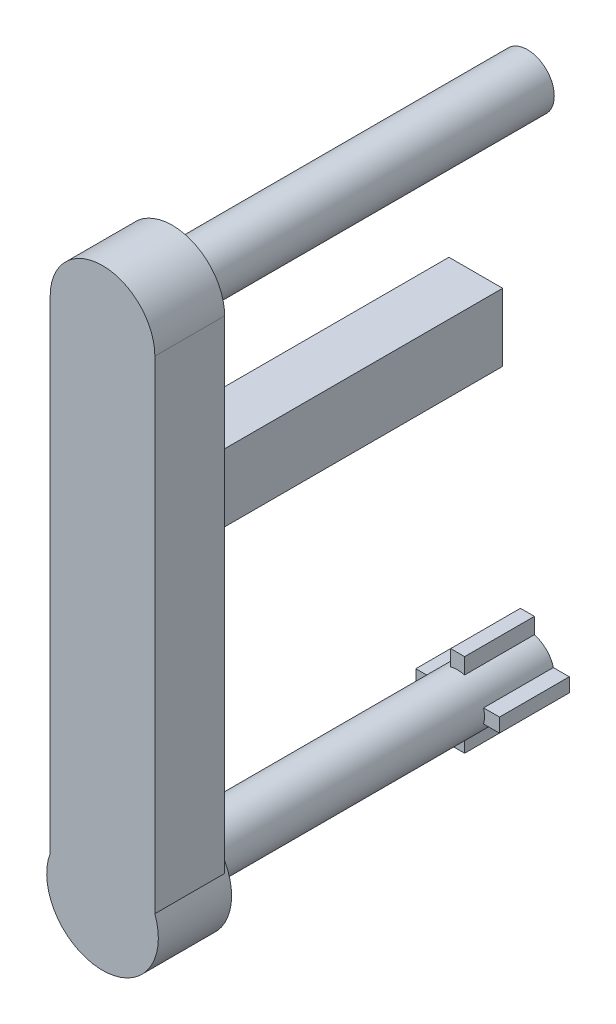
ISO-10303-21;
HEADER;
FILE_DESCRIPTION(('STEP AP214'),'2;1');
FILE_NAME('part.step','',(''),(''),'','','');
FILE_SCHEMA(('AUTOMOTIVE_DESIGN { 1 0 10303 214 1 1 1 1 }'));
ENDSEC;
DATA;
#1=APPLICATION_CONTEXT('core data for automotive mechanical design processes');
#2=APPLICATION_PROTOCOL_DEFINITION('international standard','automotive_design',2000,#1);
#3=PRODUCT_CONTEXT('',#1,'mechanical');
#4=PRODUCT('Part','Part','',(#3));
#5=PRODUCT_RELATED_PRODUCT_CATEGORY('part','',(#4));
#6=PRODUCT_DEFINITION_FORMATION('','',#4);
#7=PRODUCT_DEFINITION_CONTEXT('part definition',#1,'design');
#8=PRODUCT_DEFINITION('design','',#6,#7);
#9=PRODUCT_DEFINITION_SHAPE('','',#8);
#10=(LENGTH_UNIT() NAMED_UNIT(*) SI_UNIT(.MILLI.,.METRE.));
#11=(NAMED_UNIT(*) PLANE_ANGLE_UNIT() SI_UNIT($,.RADIAN.));
#12=(NAMED_UNIT(*) SI_UNIT($,.STERADIAN.) SOLID_ANGLE_UNIT());
#13=UNCERTAINTY_MEASURE_WITH_UNIT(LENGTH_MEASURE(1.E-05),#10,'distance_accuracy_value','');
#14=(GEOMETRIC_REPRESENTATION_CONTEXT(3) GLOBAL_UNCERTAINTY_ASSIGNED_CONTEXT((#13)) GLOBAL_UNIT_ASSIGNED_CONTEXT((#10,
#11,#12)) REPRESENTATION_CONTEXT('',''));
#15=CARTESIAN_POINT('',(0.,0.,0.));
#16=DIRECTION('',(0.,0.,1.));
#17=DIRECTION('',(1.,0.,0.));
#18=AXIS2_PLACEMENT_3D('',#15,#16,#17);
#19=CARTESIAN_POINT('',(0.,72.,-10.));
#20=DIRECTION('',(0.,0.,1.));
#21=DIRECTION('',(1.,0.,0.));
#22=AXIS2_PLACEMENT_3D('',#19,#20,#21);
#23=PLANE('',#22);
#24=CARTESIAN_POINT('',(0.,0.,-10.));
#25=DIRECTION('',(0.,0.,1.));
#26=DIRECTION('',(1.,0.,0.));
#27=AXIS2_PLACEMENT_3D('',#24,#25,#26);
#28=CIRCLE('',#27,8.);
#29=CARTESIAN_POINT('',(-7.49999999999999,2.78388218141504,-10.));
#30=VERTEX_POINT('',#29);
#31=CARTESIAN_POINT('',(7.49999999999999,2.78388218141504,-10.));
#32=VERTEX_POINT('',#31);
#33=EDGE_CURVE('E397',#30,#32,#28,.F.);
#34=ORIENTED_EDGE('',*,*,#33,.F.);
#35=DIRECTION('',(0.,-1.,0.));
#36=VECTOR('',#35,1.);
#37=CARTESIAN_POINT('',(-7.5,72.,-10.));
#38=LINE('',#37,#36);
#39=CARTESIAN_POINT('',(-7.5,72.,-10.));
#40=VERTEX_POINT('',#39);
#41=EDGE_CURVE('E253',#40,#30,#38,.T.);
#42=ORIENTED_EDGE('',*,*,#41,.F.);
#43=CARTESIAN_POINT('',(0.,72.,-10.));
#44=DIRECTION('',(0.,0.,1.));
#45=DIRECTION('',(1.,0.,0.));
#46=AXIS2_PLACEMENT_3D('',#43,#44,#45);
#47=CIRCLE('',#46,7.5);
#48=CARTESIAN_POINT('',(7.5,72.,-10.));
#49=VERTEX_POINT('',#48);
#50=EDGE_CURVE('E250',#49,#40,#47,.T.);
#51=ORIENTED_EDGE('',*,*,#50,.F.);
#52=DIRECTION('',(0.,1.,0.));
#53=VECTOR('',#52,1.);
#54=CARTESIAN_POINT('',(7.5,72.,-10.));
#55=LINE('',#54,#53);
#56=EDGE_CURVE('E257',#32,#49,#55,.T.);
#57=ORIENTED_EDGE('',*,*,#56,.F.);
#58=EDGE_LOOP('',(#34,#42,#51,#57));
#59=FACE_BOUND('',#58,.T.);
#60=CARTESIAN_POINT('',(0.,72.,-10.));
#61=DIRECTION('',(0.,0.,1.));
#62=DIRECTION('',(1.,0.,0.));
#63=AXIS2_PLACEMENT_3D('',#60,#61,#62);
#64=CIRCLE('',#63,4.5);
#65=CARTESIAN_POINT('',(4.5,72.,-10.));
#66=VERTEX_POINT('',#65);
#67=EDGE_CURVE('E49',#66,#66,#64,.F.);
#68=ORIENTED_EDGE('',*,*,#67,.F.);
#69=EDGE_LOOP('',(#68));
#70=FACE_BOUND('',#69,.T.);
#71=DIRECTION('',(0.,-1.,0.));
#72=VECTOR('',#71,1.);
#73=CARTESIAN_POINT('',(3.85000000000013,42.15,-10.));
#74=LINE('',#73,#72);
#75=CARTESIAN_POINT('',(3.85000000000013,51.85,-10.));
#76=VERTEX_POINT('',#75);
#77=CARTESIAN_POINT('',(3.85000000000013,42.15,-10.));
#78=VERTEX_POINT('',#77);
#79=EDGE_CURVE('E61',#76,#78,#74,.T.);
#80=ORIENTED_EDGE('',*,*,#79,.F.);
#81=DIRECTION('',(1.,0.,0.));
#82=VECTOR('',#81,1.);
#83=CARTESIAN_POINT('',(3.85000000000013,51.85,-10.));
#84=LINE('',#83,#82);
#85=CARTESIAN_POINT('',(-3.84939999999989,51.85,-10.));
#86=VERTEX_POINT('',#85);
#87=EDGE_CURVE('E66',#86,#76,#84,.T.);
#88=ORIENTED_EDGE('',*,*,#87,.F.);
#89=DIRECTION('',(0.,1.,0.));
#90=VECTOR('',#89,1.);
#91=CARTESIAN_POINT('',(-3.84939999999989,51.85,-10.));
#92=LINE('',#91,#90);
#93=CARTESIAN_POINT('',(-3.84939999999989,42.15,-10.));
#94=VERTEX_POINT('',#93);
#95=EDGE_CURVE('E204',#94,#86,#92,.T.);
#96=ORIENTED_EDGE('',*,*,#95,.F.);
#97=DIRECTION('',(-1.,0.,0.));
#98=VECTOR('',#97,1.);
#99=CARTESIAN_POINT('',(-3.84939999999989,42.15,-10.));
#100=LINE('',#99,#98);
#101=EDGE_CURVE('E207',#78,#94,#100,.T.);
#102=ORIENTED_EDGE('',*,*,#101,.F.);
#103=EDGE_LOOP('',(#80,#88,#96,#102));
#104=FACE_BOUND('',#103,.T.);
#105=ADVANCED_FACE('F45',(#59,#70,#104),#23,.F.);
#106=CARTESIAN_POINT('',(0.,0.,-10.5));
#107=DIRECTION('',(0.,0.,1.));
#108=DIRECTION('',(1.,0.,0.));
#109=AXIS2_PLACEMENT_3D('',#106,#107,#108);
#110=CYLINDRICAL_SURFACE('',#109,8.);
#111=DIRECTION('',(0.,0.,1.));
#112=VECTOR('',#111,1.);
#113=CARTESIAN_POINT('',(7.49999999999999,2.78388218141504,-10.));
#114=LINE('',#113,#112);
#115=CARTESIAN_POINT('',(7.49999999999999,2.78388218141504,0.));
#116=VERTEX_POINT('',#115);
#117=EDGE_CURVE('E270',#32,#116,#114,.T.);
#118=ORIENTED_EDGE('',*,*,#117,.T.);
#119=CARTESIAN_POINT('',(0.,0.,0.));
#120=DIRECTION('',(0.,0.,1.));
#121=DIRECTION('',(1.,0.,0.));
#122=AXIS2_PLACEMENT_3D('',#119,#120,#121);
#123=CIRCLE('',#122,8.);
#124=CARTESIAN_POINT('',(-7.49999999999999,2.78388218141503,0.));
#125=VERTEX_POINT('',#124);
#126=EDGE_CURVE('E347',#125,#116,#123,.T.);
#127=ORIENTED_EDGE('',*,*,#126,.F.);
#128=DIRECTION('',(0.,0.,1.));
#129=VECTOR('',#128,1.);
#130=CARTESIAN_POINT('',(-7.49999999999999,2.78388218141504,-10.));
#131=LINE('',#130,#129);
#132=EDGE_CURVE('E273',#30,#125,#131,.T.);
#133=ORIENTED_EDGE('',*,*,#132,.F.);
#134=ORIENTED_EDGE('',*,*,#33,.T.);
#135=EDGE_LOOP('',(#118,#127,#133,#134));
#136=FACE_BOUND('',#135,.T.);
#137=CARTESIAN_POINT('',(0.,0.,-10.5));
#138=DIRECTION('',(0.,0.,1.));
#139=DIRECTION('',(1.,0.,0.));
#140=AXIS2_PLACEMENT_3D('',#137,#138,#139);
#141=CIRCLE('',#140,8.);
#142=CARTESIAN_POINT('',(8.,0.,-10.5));
#143=VERTEX_POINT('',#142);
#144=EDGE_CURVE('E369',#143,#143,#141,.T.);
#145=ORIENTED_EDGE('',*,*,#144,.T.);
#146=EDGE_LOOP('',(#145));
#147=FACE_BOUND('',#146,.T.);
#148=ADVANCED_FACE('F47',(#136,#147),#110,.T.);
#149=CARTESIAN_POINT('',(0.,0.,-10.5));
#150=DIRECTION('',(0.,0.,1.));
#151=DIRECTION('',(1.,0.,0.));
#152=AXIS2_PLACEMENT_3D('',#149,#150,#151);
#153=PLANE('',#152);
#154=CARTESIAN_POINT('',(0.,0.,-10.5));
#155=DIRECTION('',(0.,0.,-1.));
#156=DIRECTION('',(-1.,0.,0.));
#157=AXIS2_PLACEMENT_3D('',#154,#155,#156);
#158=CIRCLE('',#157,3.85);
#159=CARTESIAN_POINT('',(-3.85,0.,-10.5));
#160=VERTEX_POINT('',#159);
#161=EDGE_CURVE('E365',#160,#160,#158,.T.);
#162=ORIENTED_EDGE('',*,*,#161,.F.);
#163=EDGE_LOOP('',(#162));
#164=FACE_BOUND('',#163,.T.);
#165=ORIENTED_EDGE('',*,*,#144,.F.);
#166=EDGE_LOOP('',(#165));
#167=FACE_BOUND('',#166,.T.);
#168=ADVANCED_FACE('F499',(#164,#167),#153,.F.);
#169=CARTESIAN_POINT('',(0.,0.,0.));
#170=DIRECTION('',(0.,0.,1.));
#171=DIRECTION('',(1.,0.,0.));
#172=AXIS2_PLACEMENT_3D('',#169,#170,#171);
#173=PLANE('',#172);
#174=ORIENTED_EDGE('',*,*,#126,.T.);
#175=DIRECTION('',(0.,1.,0.));
#176=VECTOR('',#175,1.);
#177=CARTESIAN_POINT('',(7.5,72.,0.));
#178=LINE('',#177,#176);
#179=CARTESIAN_POINT('',(7.5,72.,0.));
#180=VERTEX_POINT('',#179);
#181=EDGE_CURVE('E254',#116,#180,#178,.T.);
#182=ORIENTED_EDGE('',*,*,#181,.T.);
#183=CARTESIAN_POINT('',(0.,72.,0.));
#184=DIRECTION('',(0.,0.,1.));
#185=DIRECTION('',(1.,0.,0.));
#186=AXIS2_PLACEMENT_3D('',#183,#184,#185);
#187=CIRCLE('',#186,7.5);
#188=CARTESIAN_POINT('',(-7.5,72.,0.));
#189=VERTEX_POINT('',#188);
#190=EDGE_CURVE('E249',#180,#189,#187,.T.);
#191=ORIENTED_EDGE('',*,*,#190,.T.);
#192=DIRECTION('',(0.,-1.,0.));
#193=VECTOR('',#192,1.);
#194=CARTESIAN_POINT('',(-7.5,72.,0.));
#195=LINE('',#194,#193);
#196=EDGE_CURVE('E263',#189,#125,#195,.T.);
#197=ORIENTED_EDGE('',*,*,#196,.T.);
#198=EDGE_LOOP('',(#174,#182,#191,#197));
#199=FACE_BOUND('',#198,.T.);
#200=ADVANCED_FACE('F550',(#199),#173,.T.);
#201=CARTESIAN_POINT('',(0.,0.,-70.5));
#202=DIRECTION('',(0.,0.,1.));
#203=DIRECTION('',(1.,0.,0.));
#204=AXIS2_PLACEMENT_3D('',#201,#202,#203);
#205=CYLINDRICAL_SURFACE('',#204,3.85);
#206=DIRECTION('',(0.,0.,1.));
#207=VECTOR('',#206,1.);
#208=CARTESIAN_POINT('',(3.71786228900424,1.00000000000006,-70.5));
#209=LINE('',#208,#207);
#210=CARTESIAN_POINT('',(3.71786228900424,1.00000000000006,-50.9));
#211=VERTEX_POINT('',#210);
#212=CARTESIAN_POINT('',(3.71786228900424,1.00000000000006,-60.9));
#213=VERTEX_POINT('',#212);
#214=EDGE_CURVE('E368',#211,#213,#209,.F.);
#215=ORIENTED_EDGE('',*,*,#214,.T.);
#216=CARTESIAN_POINT('',(0.,0.,-60.9));
#217=DIRECTION('',(0.,0.,1.));
#218=DIRECTION('',(1.,0.,0.));
#219=AXIS2_PLACEMENT_3D('',#216,#217,#218);
#220=CIRCLE('',#219,3.85);
#221=CARTESIAN_POINT('',(0.999999999999999,3.71786228900426,-60.9));
#222=VERTEX_POINT('',#221);
#223=EDGE_CURVE('E269',#222,#213,#220,.F.);
#224=ORIENTED_EDGE('',*,*,#223,.F.);
#225=DIRECTION('',(0.,0.,1.));
#226=VECTOR('',#225,1.);
#227=CARTESIAN_POINT('',(0.999999999999999,3.71786228900426,-70.5));
#228=LINE('',#227,#226);
#229=CARTESIAN_POINT('',(0.999999999999999,3.71786228900426,-50.9));
#230=VERTEX_POINT('',#229);
#231=EDGE_CURVE('E396',#222,#230,#228,.T.);
#232=ORIENTED_EDGE('',*,*,#231,.T.);
#233=CARTESIAN_POINT('',(0.,0.,-50.9));
#234=DIRECTION('',(0.,0.,1.));
#235=DIRECTION('',(1.,0.,0.));
#236=AXIS2_PLACEMENT_3D('',#233,#234,#235);
#237=CIRCLE('',#236,3.85);
#238=CARTESIAN_POINT('',(-1.,3.71786228900426,-50.9));
#239=VERTEX_POINT('',#238);
#240=EDGE_CURVE('E381',#230,#239,#237,.T.);
#241=ORIENTED_EDGE('',*,*,#240,.T.);
#242=DIRECTION('',(0.,0.,1.));
#243=VECTOR('',#242,1.);
#244=CARTESIAN_POINT('',(-1.,3.71786228900426,-70.5));
#245=LINE('',#244,#243);
#246=CARTESIAN_POINT('',(-1.,3.71786228900426,-60.9));
#247=VERTEX_POINT('',#246);
#248=EDGE_CURVE('E393',#239,#247,#245,.F.);
#249=ORIENTED_EDGE('',*,*,#248,.T.);
#250=CARTESIAN_POINT('',(-3.71786228900426,1.00000000000002,-60.9));
#251=VERTEX_POINT('',#250);
#252=EDGE_CURVE('E446',#251,#247,#220,.F.);
#253=ORIENTED_EDGE('',*,*,#252,.F.);
#254=DIRECTION('',(0.,0.,1.));
#255=VECTOR('',#254,1.);
#256=CARTESIAN_POINT('',(-3.71786228900426,1.00000000000002,-70.5));
#257=LINE('',#256,#255);
#258=CARTESIAN_POINT('',(-3.71786228900426,1.00000000000002,-50.9));
#259=VERTEX_POINT('',#258);
#260=EDGE_CURVE('E390',#251,#259,#257,.T.);
#261=ORIENTED_EDGE('',*,*,#260,.T.);
#262=CARTESIAN_POINT('',(-3.71786228900425,-1.00000000000002,-50.9));
#263=VERTEX_POINT('',#262);
#264=EDGE_CURVE('E392',#259,#263,#237,.T.);
#265=ORIENTED_EDGE('',*,*,#264,.T.);
#266=DIRECTION('',(0.,0.,1.));
#267=VECTOR('',#266,1.);
#268=CARTESIAN_POINT('',(-3.71786228900425,-1.00000000000002,-70.5));
#269=LINE('',#268,#267);
#270=CARTESIAN_POINT('',(-3.71786228900425,-1.00000000000002,-60.9));
#271=VERTEX_POINT('',#270);
#272=EDGE_CURVE('E387',#263,#271,#269,.F.);
#273=ORIENTED_EDGE('',*,*,#272,.T.);
#274=CARTESIAN_POINT('',(-0.999999999999977,-3.71786228900427,-60.9));
#275=VERTEX_POINT('',#274);
#276=EDGE_CURVE('E280',#275,#271,#220,.F.);
#277=ORIENTED_EDGE('',*,*,#276,.F.);
#278=DIRECTION('',(0.,0.,1.));
#279=VECTOR('',#278,1.);
#280=CARTESIAN_POINT('',(-0.999999999999977,-3.71786228900427,-70.5));
#281=LINE('',#280,#279);
#282=CARTESIAN_POINT('',(-0.999999999999977,-3.71786228900427,-50.9));
#283=VERTEX_POINT('',#282);
#284=EDGE_CURVE('E385',#275,#283,#281,.T.);
#285=ORIENTED_EDGE('',*,*,#284,.T.);
#286=CARTESIAN_POINT('',(1.00000000000002,-3.71786228900425,-50.9));
#287=VERTEX_POINT('',#286);
#288=EDGE_CURVE('E382',#283,#287,#237,.T.);
#289=ORIENTED_EDGE('',*,*,#288,.T.);
#290=DIRECTION('',(0.,0.,1.));
#291=VECTOR('',#290,1.);
#292=CARTESIAN_POINT('',(1.00000000000002,-3.71786228900425,-70.5));
#293=LINE('',#292,#291);
#294=CARTESIAN_POINT('',(1.00000000000002,-3.71786228900425,-60.9));
#295=VERTEX_POINT('',#294);
#296=EDGE_CURVE('E380',#287,#295,#293,.F.);
#297=ORIENTED_EDGE('',*,*,#296,.T.);
#298=CARTESIAN_POINT('',(3.71786228900427,-0.999999999999976,-60.9));
#299=VERTEX_POINT('',#298);
#300=EDGE_CURVE('E277',#299,#295,#220,.F.);
#301=ORIENTED_EDGE('',*,*,#300,.F.);
#302=DIRECTION('',(0.,0.,1.));
#303=VECTOR('',#302,1.);
#304=CARTESIAN_POINT('',(3.71786228900427,-0.999999999999976,-70.5));
#305=LINE('',#304,#303);
#306=CARTESIAN_POINT('',(3.71786228900427,-0.999999999999976,-50.9));
#307=VERTEX_POINT('',#306);
#308=EDGE_CURVE('E376',#299,#307,#305,.T.);
#309=ORIENTED_EDGE('',*,*,#308,.T.);
#310=EDGE_CURVE('E378',#307,#211,#237,.T.);
#311=ORIENTED_EDGE('',*,*,#310,.T.);
#312=EDGE_LOOP('',(#215,#224,#232,#241,#249,#253,#261,#265,#273,#277,#285,#289,#297,#301,#309,#311));
#313=FACE_BOUND('',#312,.T.);
#314=ORIENTED_EDGE('',*,*,#161,.T.);
#315=EDGE_LOOP('',(#314));
#316=FACE_BOUND('',#315,.T.);
#317=ADVANCED_FACE('F409',(#313,#316),#205,.T.);
#318=CARTESIAN_POINT('',(6.00000000000001,-0.999999999999937,-50.9));
#319=DIRECTION('',(1.,0.,0.));
#320=DIRECTION('',(0.,1.,0.));
#321=AXIS2_PLACEMENT_3D('',#318,#319,#320);
#322=PLANE('',#321);
#323=DIRECTION('',(0.,-1.,0.));
#324=VECTOR('',#323,1.);
#325=CARTESIAN_POINT('',(6.00000000000001,-0.999999999999937,-60.9));
#326=LINE('',#325,#324);
#327=CARTESIAN_POINT('',(5.99999999999999,1.00000000000006,-60.9));
#328=VERTEX_POINT('',#327);
#329=CARTESIAN_POINT('',(6.00000000000001,-0.999999999999937,-60.9));
#330=VERTEX_POINT('',#329);
#331=EDGE_CURVE('E319',#328,#330,#326,.T.);
#332=ORIENTED_EDGE('',*,*,#331,.F.);
#333=DIRECTION('',(0.,0.,-1.));
#334=VECTOR('',#333,1.);
#335=CARTESIAN_POINT('',(5.99999999999999,1.00000000000006,-50.9));
#336=LINE('',#335,#334);
#337=CARTESIAN_POINT('',(5.99999999999999,1.00000000000006,-50.9));
#338=VERTEX_POINT('',#337);
#339=EDGE_CURVE('E314',#338,#328,#336,.T.);
#340=ORIENTED_EDGE('',*,*,#339,.F.);
#341=DIRECTION('',(0.,-1.,0.));
#342=VECTOR('',#341,1.);
#343=CARTESIAN_POINT('',(6.00000000000001,-0.999999999999937,-50.9));
#344=LINE('',#343,#342);
#345=CARTESIAN_POINT('',(6.00000000000001,-0.999999999999937,-50.9));
#346=VERTEX_POINT('',#345);
#347=EDGE_CURVE('E287',#338,#346,#344,.T.);
#348=ORIENTED_EDGE('',*,*,#347,.T.);
#349=DIRECTION('',(0.,0.,-1.));
#350=VECTOR('',#349,1.);
#351=CARTESIAN_POINT('',(6.00000000000001,-0.999999999999937,-50.9));
#352=LINE('',#351,#350);
#353=EDGE_CURVE('E361',#346,#330,#352,.T.);
#354=ORIENTED_EDGE('',*,*,#353,.T.);
#355=EDGE_LOOP('',(#332,#340,#348,#354));
#356=FACE_BOUND('',#355,.T.);
#357=ADVANCED_FACE('F440',(#356),#322,.T.);
#358=CARTESIAN_POINT('',(0.,0.,-50.9));
#359=DIRECTION('',(0.,0.,1.));
#360=DIRECTION('',(1.,0.,0.));
#361=AXIS2_PLACEMENT_3D('',#358,#359,#360);
#362=PLANE('',#361);
#363=ORIENTED_EDGE('',*,*,#310,.F.);
#364=DIRECTION('',(-1.,0.,0.));
#365=VECTOR('',#364,1.);
#366=CARTESIAN_POINT('',(0.999999999999999,-1.00000000000002,-50.9));
#367=LINE('',#366,#365);
#368=EDGE_CURVE('E290',#346,#307,#367,.T.);
#369=ORIENTED_EDGE('',*,*,#368,.F.);
#370=ORIENTED_EDGE('',*,*,#347,.F.);
#371=DIRECTION('',(1.,0.,0.));
#372=VECTOR('',#371,1.);
#373=CARTESIAN_POINT('',(5.99999999999999,1.00000000000006,-50.9));
#374=LINE('',#373,#372);
#375=EDGE_CURVE('E284',#211,#338,#374,.T.);
#376=ORIENTED_EDGE('',*,*,#375,.F.);
#377=EDGE_LOOP('',(#363,#369,#370,#376));
#378=FACE_BOUND('',#377,.T.);
#379=ADVANCED_FACE('F435',(#378),#362,.T.);
#380=CARTESIAN_POINT('',(5.99999999999999,1.00000000000006,-50.9));
#381=DIRECTION('',(0.,1.,0.));
#382=DIRECTION('',(0.,0.,1.));
#383=AXIS2_PLACEMENT_3D('',#380,#381,#382);
#384=PLANE('',#383);
#385=ORIENTED_EDGE('',*,*,#214,.F.);
#386=ORIENTED_EDGE('',*,*,#375,.T.);
#387=ORIENTED_EDGE('',*,*,#339,.T.);
#388=DIRECTION('',(1.,0.,0.));
#389=VECTOR('',#388,1.);
#390=CARTESIAN_POINT('',(5.99999999999999,1.00000000000006,-60.9));
#391=LINE('',#390,#389);
#392=EDGE_CURVE('E317',#213,#328,#391,.T.);
#393=ORIENTED_EDGE('',*,*,#392,.F.);
#394=EDGE_LOOP('',(#385,#386,#387,#393));
#395=FACE_BOUND('',#394,.T.);
#396=ADVANCED_FACE('F444',(#395),#384,.T.);
#397=CARTESIAN_POINT('',(0.999999999999999,-1.00000000000002,-50.9));
#398=DIRECTION('',(0.,-1.,0.));
#399=DIRECTION('',(1.,0.,0.));
#400=AXIS2_PLACEMENT_3D('',#397,#398,#399);
#401=PLANE('',#400);
#402=ORIENTED_EDGE('',*,*,#308,.F.);
#403=DIRECTION('',(-1.,0.,0.));
#404=VECTOR('',#403,1.);
#405=CARTESIAN_POINT('',(0.999999999999999,-1.00000000000002,-60.9));
#406=LINE('',#405,#404);
#407=EDGE_CURVE('E322',#330,#299,#406,.T.);
#408=ORIENTED_EDGE('',*,*,#407,.F.);
#409=ORIENTED_EDGE('',*,*,#353,.F.);
#410=ORIENTED_EDGE('',*,*,#368,.T.);
#411=EDGE_LOOP('',(#402,#408,#409,#410));
#412=FACE_BOUND('',#411,.T.);
#413=ADVANCED_FACE('F431',(#412),#401,.T.);
#414=CARTESIAN_POINT('',(-0.999999999999958,-6.00000000000001,-50.9));
#415=DIRECTION('',(0.,-1.,0.));
#416=DIRECTION('',(1.,0.,0.));
#417=AXIS2_PLACEMENT_3D('',#414,#415,#416);
#418=PLANE('',#417);
#419=DIRECTION('',(-1.,0.,0.));
#420=VECTOR('',#419,1.);
#421=CARTESIAN_POINT('',(-0.999999999999958,-6.00000000000001,-60.9));
#422=LINE('',#421,#420);
#423=CARTESIAN_POINT('',(1.00000000000004,-5.99999999999999,-60.9));
#424=VERTEX_POINT('',#423);
#425=CARTESIAN_POINT('',(-0.999999999999958,-6.00000000000001,-60.9));
#426=VERTEX_POINT('',#425);
#427=EDGE_CURVE('E327',#424,#426,#422,.T.);
#428=ORIENTED_EDGE('',*,*,#427,.F.);
#429=DIRECTION('',(0.,0.,-1.));
#430=VECTOR('',#429,1.);
#431=CARTESIAN_POINT('',(1.00000000000004,-5.99999999999999,-50.9));
#432=LINE('',#431,#430);
#433=CARTESIAN_POINT('',(1.00000000000004,-5.99999999999999,-50.9));
#434=VERTEX_POINT('',#433);
#435=EDGE_CURVE('E358',#434,#424,#432,.T.);
#436=ORIENTED_EDGE('',*,*,#435,.F.);
#437=DIRECTION('',(-1.,0.,0.));
#438=VECTOR('',#437,1.);
#439=CARTESIAN_POINT('',(-0.999999999999958,-6.00000000000001,-50.9));
#440=LINE('',#439,#438);
#441=CARTESIAN_POINT('',(-0.999999999999958,-6.00000000000001,-50.9));
#442=VERTEX_POINT('',#441);
#443=EDGE_CURVE('E295',#434,#442,#440,.T.);
#444=ORIENTED_EDGE('',*,*,#443,.T.);
#445=DIRECTION('',(0.,0.,-1.));
#446=VECTOR('',#445,1.);
#447=CARTESIAN_POINT('',(-0.999999999999958,-6.00000000000001,-50.9));
#448=LINE('',#447,#446);
#449=EDGE_CURVE('E356',#442,#426,#448,.T.);
#450=ORIENTED_EDGE('',*,*,#449,.T.);
#451=EDGE_LOOP('',(#428,#436,#444,#450));
#452=FACE_BOUND('',#451,.T.);
#453=ADVANCED_FACE('F423',(#452),#418,.T.);
#454=ORIENTED_EDGE('',*,*,#288,.F.);
#455=DIRECTION('',(0.,1.,0.));
#456=VECTOR('',#455,1.);
#457=CARTESIAN_POINT('',(-1.,-1.00000000000002,-50.9));
#458=LINE('',#457,#456);
#459=EDGE_CURVE('E298',#442,#283,#458,.T.);
#460=ORIENTED_EDGE('',*,*,#459,.F.);
#461=ORIENTED_EDGE('',*,*,#443,.F.);
#462=DIRECTION('',(0.,-1.,0.));
#463=VECTOR('',#462,1.);
#464=CARTESIAN_POINT('',(1.00000000000004,-5.99999999999999,-50.9));
#465=LINE('',#464,#463);
#466=EDGE_CURVE('E293',#287,#434,#465,.T.);
#467=ORIENTED_EDGE('',*,*,#466,.F.);
#468=EDGE_LOOP('',(#454,#460,#461,#467));
#469=FACE_BOUND('',#468,.T.);
#470=ADVANCED_FACE('F420',(#469),#362,.T.);
#471=CARTESIAN_POINT('',(1.00000000000004,-5.99999999999999,-50.9));
#472=DIRECTION('',(1.,0.,0.));
#473=DIRECTION('',(0.,1.,0.));
#474=AXIS2_PLACEMENT_3D('',#471,#472,#473);
#475=PLANE('',#474);
#476=ORIENTED_EDGE('',*,*,#296,.F.);
#477=ORIENTED_EDGE('',*,*,#466,.T.);
#478=ORIENTED_EDGE('',*,*,#435,.T.);
#479=DIRECTION('',(0.,-1.,0.));
#480=VECTOR('',#479,1.);
#481=CARTESIAN_POINT('',(1.00000000000004,-5.99999999999999,-60.9));
#482=LINE('',#481,#480);
#483=EDGE_CURVE('E325',#295,#424,#482,.T.);
#484=ORIENTED_EDGE('',*,*,#483,.F.);
#485=EDGE_LOOP('',(#476,#477,#478,#484));
#486=FACE_BOUND('',#485,.T.);
#487=ADVANCED_FACE('F417',(#486),#475,.T.);
#488=CARTESIAN_POINT('',(-1.,-1.00000000000002,-50.9));
#489=DIRECTION('',(-1.,0.,0.));
#490=DIRECTION('',(0.,-1.,0.));
#491=AXIS2_PLACEMENT_3D('',#488,#489,#490);
#492=PLANE('',#491);
#493=ORIENTED_EDGE('',*,*,#284,.F.);
#494=DIRECTION('',(0.,1.,0.));
#495=VECTOR('',#494,1.);
#496=CARTESIAN_POINT('',(-1.,-1.00000000000002,-60.9));
#497=LINE('',#496,#495);
#498=EDGE_CURVE('E330',#426,#275,#497,.T.);
#499=ORIENTED_EDGE('',*,*,#498,.F.);
#500=ORIENTED_EDGE('',*,*,#449,.F.);
#501=ORIENTED_EDGE('',*,*,#459,.T.);
#502=EDGE_LOOP('',(#493,#499,#500,#501));
#503=FACE_BOUND('',#502,.T.);
#504=ADVANCED_FACE('F479',(#503),#492,.T.);
#505=CARTESIAN_POINT('',(-6.,0.999999999999978,-50.9));
#506=DIRECTION('',(-1.,0.,0.));
#507=DIRECTION('',(0.,-1.,0.));
#508=AXIS2_PLACEMENT_3D('',#505,#506,#507);
#509=PLANE('',#508);
#510=DIRECTION('',(0.,1.,0.));
#511=VECTOR('',#510,1.);
#512=CARTESIAN_POINT('',(-6.,0.999999999999978,-60.9));
#513=LINE('',#512,#511);
#514=CARTESIAN_POINT('',(-6.,-1.00000000000002,-60.9));
#515=VERTEX_POINT('',#514);
#516=CARTESIAN_POINT('',(-6.,0.999999999999978,-60.9));
#517=VERTEX_POINT('',#516);
#518=EDGE_CURVE('E335',#515,#517,#513,.T.);
#519=ORIENTED_EDGE('',*,*,#518,.F.);
#520=DIRECTION('',(0.,0.,-1.));
#521=VECTOR('',#520,1.);
#522=CARTESIAN_POINT('',(-6.,-1.00000000000002,-50.9));
#523=LINE('',#522,#521);
#524=CARTESIAN_POINT('',(-6.,-1.00000000000002,-50.9));
#525=VERTEX_POINT('',#524);
#526=EDGE_CURVE('E353',#525,#515,#523,.T.);
#527=ORIENTED_EDGE('',*,*,#526,.F.);
#528=DIRECTION('',(0.,1.,0.));
#529=VECTOR('',#528,1.);
#530=CARTESIAN_POINT('',(-6.,0.999999999999978,-50.9));
#531=LINE('',#530,#529);
#532=CARTESIAN_POINT('',(-6.,0.999999999999978,-50.9));
#533=VERTEX_POINT('',#532);
#534=EDGE_CURVE('E303',#525,#533,#531,.T.);
#535=ORIENTED_EDGE('',*,*,#534,.T.);
#536=DIRECTION('',(0.,0.,-1.));
#537=VECTOR('',#536,1.);
#538=CARTESIAN_POINT('',(-6.,0.999999999999978,-50.9));
#539=LINE('',#538,#537);
#540=EDGE_CURVE('E351',#533,#517,#539,.T.);
#541=ORIENTED_EDGE('',*,*,#540,.T.);
#542=EDGE_LOOP('',(#519,#527,#535,#541));
#543=FACE_BOUND('',#542,.T.);
#544=ADVANCED_FACE('F471',(#543),#509,.T.);
#545=ORIENTED_EDGE('',*,*,#264,.F.);
#546=DIRECTION('',(1.,0.,0.));
#547=VECTOR('',#546,1.);
#548=CARTESIAN_POINT('',(-1.,1.00000000000006,-50.9));
#549=LINE('',#548,#547);
#550=EDGE_CURVE('E306',#533,#259,#549,.T.);
#551=ORIENTED_EDGE('',*,*,#550,.F.);
#552=ORIENTED_EDGE('',*,*,#534,.F.);
#553=DIRECTION('',(-1.,0.,0.));
#554=VECTOR('',#553,1.);
#555=CARTESIAN_POINT('',(-6.,-1.00000000000002,-50.9));
#556=LINE('',#555,#554);
#557=EDGE_CURVE('E301',#263,#525,#556,.T.);
#558=ORIENTED_EDGE('',*,*,#557,.F.);
#559=EDGE_LOOP('',(#545,#551,#552,#558));
#560=FACE_BOUND('',#559,.T.);
#561=ADVANCED_FACE('F474',(#560),#362,.T.);
#562=CARTESIAN_POINT('',(-6.,-1.00000000000002,-50.9));
#563=DIRECTION('',(0.,-1.,0.));
#564=DIRECTION('',(0.,0.,-1.));
#565=AXIS2_PLACEMENT_3D('',#562,#563,#564);
#566=PLANE('',#565);
#567=ORIENTED_EDGE('',*,*,#272,.F.);
#568=ORIENTED_EDGE('',*,*,#557,.T.);
#569=ORIENTED_EDGE('',*,*,#526,.T.);
#570=DIRECTION('',(-1.,0.,0.));
#571=VECTOR('',#570,1.);
#572=CARTESIAN_POINT('',(-6.,-1.00000000000002,-60.9));
#573=LINE('',#572,#571);
#574=EDGE_CURVE('E333',#271,#515,#573,.T.);
#575=ORIENTED_EDGE('',*,*,#574,.F.);
#576=EDGE_LOOP('',(#567,#568,#569,#575));
#577=FACE_BOUND('',#576,.T.);
#578=ADVANCED_FACE('F477',(#577),#566,.T.);
#579=CARTESIAN_POINT('',(-1.,1.00000000000006,-50.9));
#580=DIRECTION('',(0.,1.,0.));
#581=DIRECTION('',(-1.,0.,0.));
#582=AXIS2_PLACEMENT_3D('',#579,#580,#581);
#583=PLANE('',#582);
#584=ORIENTED_EDGE('',*,*,#260,.F.);
#585=DIRECTION('',(1.,0.,0.));
#586=VECTOR('',#585,1.);
#587=CARTESIAN_POINT('',(-1.,1.00000000000006,-60.9));
#588=LINE('',#587,#586);
#589=EDGE_CURVE('E338',#517,#251,#588,.T.);
#590=ORIENTED_EDGE('',*,*,#589,.F.);
#591=ORIENTED_EDGE('',*,*,#540,.F.);
#592=ORIENTED_EDGE('',*,*,#550,.T.);
#593=EDGE_LOOP('',(#584,#590,#591,#592));
#594=FACE_BOUND('',#593,.T.);
#595=ADVANCED_FACE('F465',(#594),#583,.T.);
#596=CARTESIAN_POINT('',(0.999999999999999,1.00000000000006,-50.9));
#597=DIRECTION('',(1.,0.,0.));
#598=DIRECTION('',(0.,0.,-1.));
#599=AXIS2_PLACEMENT_3D('',#596,#597,#598);
#600=PLANE('',#599);
#601=ORIENTED_EDGE('',*,*,#231,.F.);
#602=DIRECTION('',(0.,-1.,0.));
#603=VECTOR('',#602,1.);
#604=CARTESIAN_POINT('',(0.999999999999999,1.00000000000006,-60.9));
#605=LINE('',#604,#603);
#606=CARTESIAN_POINT('',(0.999999999999999,6.,-60.9));
#607=VERTEX_POINT('',#606);
#608=EDGE_CURVE('E279',#607,#222,#605,.T.);
#609=ORIENTED_EDGE('',*,*,#608,.F.);
#610=DIRECTION('',(0.,0.,-1.));
#611=VECTOR('',#610,1.);
#612=CARTESIAN_POINT('',(0.999999999999999,6.,-50.9));
#613=LINE('',#612,#611);
#614=CARTESIAN_POINT('',(0.999999999999999,6.,-50.9));
#615=VERTEX_POINT('',#614);
#616=EDGE_CURVE('E345',#615,#607,#613,.T.);
#617=ORIENTED_EDGE('',*,*,#616,.F.);
#618=DIRECTION('',(0.,-1.,0.));
#619=VECTOR('',#618,1.);
#620=CARTESIAN_POINT('',(0.999999999999999,1.00000000000006,-50.9));
#621=LINE('',#620,#619);
#622=EDGE_CURVE('E281',#615,#230,#621,.T.);
#623=ORIENTED_EDGE('',*,*,#622,.T.);
#624=EDGE_LOOP('',(#601,#609,#617,#623));
#625=FACE_BOUND('',#624,.T.);
#626=ADVANCED_FACE('F449',(#625),#600,.T.);
#627=CARTESIAN_POINT('',(-1.,6.,-50.9));
#628=DIRECTION('',(-1.,0.,0.));
#629=DIRECTION('',(0.,0.,1.));
#630=AXIS2_PLACEMENT_3D('',#627,#628,#629);
#631=PLANE('',#630);
#632=ORIENTED_EDGE('',*,*,#248,.F.);
#633=DIRECTION('',(0.,1.,0.));
#634=VECTOR('',#633,1.);
#635=CARTESIAN_POINT('',(-1.,6.,-50.9));
#636=LINE('',#635,#634);
#637=CARTESIAN_POINT('',(-1.,6.,-50.9));
#638=VERTEX_POINT('',#637);
#639=EDGE_CURVE('E309',#239,#638,#636,.T.);
#640=ORIENTED_EDGE('',*,*,#639,.T.);
#641=DIRECTION('',(0.,0.,-1.));
#642=VECTOR('',#641,1.);
#643=CARTESIAN_POINT('',(-1.,6.,-50.9));
#644=LINE('',#643,#642);
#645=CARTESIAN_POINT('',(-1.,6.,-60.9));
#646=VERTEX_POINT('',#645);
#647=EDGE_CURVE('E348',#638,#646,#644,.T.);
#648=ORIENTED_EDGE('',*,*,#647,.T.);
#649=DIRECTION('',(0.,1.,0.));
#650=VECTOR('',#649,1.);
#651=CARTESIAN_POINT('',(-1.,6.,-60.9));
#652=LINE('',#651,#650);
#653=EDGE_CURVE('E341',#247,#646,#652,.T.);
#654=ORIENTED_EDGE('',*,*,#653,.F.);
#655=EDGE_LOOP('',(#632,#640,#648,#654));
#656=FACE_BOUND('',#655,.T.);
#657=ADVANCED_FACE('F461',(#656),#631,.T.);
#658=ORIENTED_EDGE('',*,*,#240,.F.);
#659=ORIENTED_EDGE('',*,*,#622,.F.);
#660=DIRECTION('',(1.,0.,0.));
#661=VECTOR('',#660,1.);
#662=CARTESIAN_POINT('',(0.999999999999999,6.,-50.9));
#663=LINE('',#662,#661);
#664=EDGE_CURVE('E311',#638,#615,#663,.T.);
#665=ORIENTED_EDGE('',*,*,#664,.F.);
#666=ORIENTED_EDGE('',*,*,#639,.F.);
#667=EDGE_LOOP('',(#658,#659,#665,#666));
#668=FACE_BOUND('',#667,.T.);
#669=ADVANCED_FACE('F458',(#668),#362,.T.);
#670=CARTESIAN_POINT('',(0.,0.,-60.9));
#671=DIRECTION('',(0.,0.,1.));
#672=DIRECTION('',(1.,0.,0.));
#673=AXIS2_PLACEMENT_3D('',#670,#671,#672);
#674=PLANE('',#673);
#675=ORIENTED_EDGE('',*,*,#608,.T.);
#676=ORIENTED_EDGE('',*,*,#223,.T.);
#677=ORIENTED_EDGE('',*,*,#392,.T.);
#678=ORIENTED_EDGE('',*,*,#331,.T.);
#679=ORIENTED_EDGE('',*,*,#407,.T.);
#680=ORIENTED_EDGE('',*,*,#300,.T.);
#681=ORIENTED_EDGE('',*,*,#483,.T.);
#682=ORIENTED_EDGE('',*,*,#427,.T.);
#683=ORIENTED_EDGE('',*,*,#498,.T.);
#684=ORIENTED_EDGE('',*,*,#276,.T.);
#685=ORIENTED_EDGE('',*,*,#574,.T.);
#686=ORIENTED_EDGE('',*,*,#518,.T.);
#687=ORIENTED_EDGE('',*,*,#589,.T.);
#688=ORIENTED_EDGE('',*,*,#252,.T.);
#689=ORIENTED_EDGE('',*,*,#653,.T.);
#690=DIRECTION('',(1.,0.,0.));
#691=VECTOR('',#690,1.);
#692=CARTESIAN_POINT('',(0.999999999999999,6.,-60.9));
#693=LINE('',#692,#691);
#694=EDGE_CURVE('E285',#646,#607,#693,.T.);
#695=ORIENTED_EDGE('',*,*,#694,.T.);
#696=EDGE_LOOP('',(#675,#676,#677,#678,#679,#680,#681,#682,#683,#684,#685,#686,#687,#688,#689,#695));
#697=FACE_BOUND('',#696,.T.);
#698=ADVANCED_FACE('F426',(#697),#674,.F.);
#699=CARTESIAN_POINT('',(0.999999999999999,6.,-50.9));
#700=DIRECTION('',(0.,1.,0.));
#701=DIRECTION('',(0.,0.,1.));
#702=AXIS2_PLACEMENT_3D('',#699,#700,#701);
#703=PLANE('',#702);
#704=ORIENTED_EDGE('',*,*,#694,.F.);
#705=ORIENTED_EDGE('',*,*,#647,.F.);
#706=ORIENTED_EDGE('',*,*,#664,.T.);
#707=ORIENTED_EDGE('',*,*,#616,.T.);
#708=EDGE_LOOP('',(#704,#705,#706,#707));
#709=FACE_BOUND('',#708,.T.);
#710=ADVANCED_FACE('F455',(#709),#703,.T.);
#711=CARTESIAN_POINT('',(0.,72.,-10.));
#712=DIRECTION('',(0.,0.,1.));
#713=DIRECTION('',(1.,0.,0.));
#714=AXIS2_PLACEMENT_3D('',#711,#712,#713);
#715=CYLINDRICAL_SURFACE('',#714,7.5);
#716=ORIENTED_EDGE('',*,*,#190,.F.);
#717=DIRECTION('',(0.,0.,1.));
#718=VECTOR('',#717,1.);
#719=CARTESIAN_POINT('',(7.5,72.,-10.));
#720=LINE('',#719,#718);
#721=EDGE_CURVE('E267',#49,#180,#720,.T.);
#722=ORIENTED_EDGE('',*,*,#721,.F.);
#723=ORIENTED_EDGE('',*,*,#50,.T.);
#724=DIRECTION('',(0.,0.,1.));
#725=VECTOR('',#724,1.);
#726=CARTESIAN_POINT('',(-7.5,72.,-10.));
#727=LINE('',#726,#725);
#728=EDGE_CURVE('E260',#40,#189,#727,.T.);
#729=ORIENTED_EDGE('',*,*,#728,.T.);
#730=EDGE_LOOP('',(#716,#722,#723,#729));
#731=FACE_BOUND('',#730,.T.);
#732=ADVANCED_FACE('F509',(#731),#715,.T.);
#733=CARTESIAN_POINT('',(7.5,72.,-10.));
#734=DIRECTION('',(1.,0.,0.));
#735=DIRECTION('',(0.,1.,0.));
#736=AXIS2_PLACEMENT_3D('',#733,#734,#735);
#737=PLANE('',#736);
#738=ORIENTED_EDGE('',*,*,#181,.F.);
#739=ORIENTED_EDGE('',*,*,#117,.F.);
#740=ORIENTED_EDGE('',*,*,#56,.T.);
#741=ORIENTED_EDGE('',*,*,#721,.T.);
#742=EDGE_LOOP('',(#738,#739,#740,#741));
#743=FACE_BOUND('',#742,.T.);
#744=ADVANCED_FACE('F505',(#743),#737,.T.);
#745=CARTESIAN_POINT('',(-7.5,72.,-10.));
#746=DIRECTION('',(-1.,0.,0.));
#747=DIRECTION('',(0.,-1.,0.));
#748=AXIS2_PLACEMENT_3D('',#745,#746,#747);
#749=PLANE('',#748);
#750=ORIENTED_EDGE('',*,*,#196,.F.);
#751=ORIENTED_EDGE('',*,*,#728,.F.);
#752=ORIENTED_EDGE('',*,*,#41,.T.);
#753=ORIENTED_EDGE('',*,*,#132,.T.);
#754=EDGE_LOOP('',(#750,#751,#752,#753));
#755=FACE_BOUND('',#754,.T.);
#756=ADVANCED_FACE('F508',(#755),#749,.T.);
#757=CARTESIAN_POINT('',(0.,72.,-10.5));
#758=DIRECTION('',(0.,0.,1.));
#759=DIRECTION('',(1.,0.,0.));
#760=AXIS2_PLACEMENT_3D('',#757,#758,#759);
#761=CYLINDRICAL_SURFACE('',#760,4.5);
#762=CARTESIAN_POINT('',(0.,72.,-10.5));
#763=DIRECTION('',(0.,0.,-1.));
#764=DIRECTION('',(-1.,0.,0.));
#765=AXIS2_PLACEMENT_3D('',#762,#763,#764);
#766=CIRCLE('',#765,4.5);
#767=CARTESIAN_POINT('',(-4.5,72.,-10.5));
#768=VERTEX_POINT('',#767);
#769=EDGE_CURVE('E246',#768,#768,#766,.T.);
#770=ORIENTED_EDGE('',*,*,#769,.F.);
#771=EDGE_LOOP('',(#770));
#772=FACE_BOUND('',#771,.T.);
#773=ORIENTED_EDGE('',*,*,#67,.T.);
#774=EDGE_LOOP('',(#773));
#775=FACE_BOUND('',#774,.T.);
#776=ADVANCED_FACE('F503',(#772,#775),#761,.T.);
#777=CARTESIAN_POINT('',(0.,72.,-10.5));
#778=DIRECTION('',(0.,0.,-1.));
#779=DIRECTION('',(-1.,0.,0.));
#780=AXIS2_PLACEMENT_3D('',#777,#778,#779);
#781=PLANE('',#780);
#782=CARTESIAN_POINT('',(0.,72.,-10.5));
#783=DIRECTION('',(0.,0.,-1.));
#784=DIRECTION('',(-1.,0.,0.));
#785=AXIS2_PLACEMENT_3D('',#782,#783,#784);
#786=CIRCLE('',#785,3.85);
#787=CARTESIAN_POINT('',(-3.85,72.,-10.5));
#788=VERTEX_POINT('',#787);
#789=EDGE_CURVE('E11',#788,#788,#786,.T.);
#790=ORIENTED_EDGE('',*,*,#789,.F.);
#791=EDGE_LOOP('',(#790));
#792=FACE_BOUND('',#791,.T.);
#793=ORIENTED_EDGE('',*,*,#769,.T.);
#794=EDGE_LOOP('',(#793));
#795=FACE_BOUND('',#794,.T.);
#796=ADVANCED_FACE('F653',(#792,#795),#781,.T.);
#797=CARTESIAN_POINT('',(0.,72.,-71.7894444302728));
#798=DIRECTION('',(0.,0.,1.));
#799=DIRECTION('',(1.,0.,0.));
#800=AXIS2_PLACEMENT_3D('',#797,#798,#799);
#801=CYLINDRICAL_SURFACE('',#800,3.85);
#802=CARTESIAN_POINT('',(0.,72.,-60.9));
#803=DIRECTION('',(0.,0.,1.));
#804=DIRECTION('',(1.,0.,0.));
#805=AXIS2_PLACEMENT_3D('',#802,#803,#804);
#806=CIRCLE('',#805,3.85);
#807=CARTESIAN_POINT('',(3.85,72.,-60.9));
#808=VERTEX_POINT('',#807);
#809=EDGE_CURVE('E243',#808,#808,#806,.T.);
#810=ORIENTED_EDGE('',*,*,#809,.T.);
#811=EDGE_LOOP('',(#810));
#812=FACE_BOUND('',#811,.T.);
#813=ORIENTED_EDGE('',*,*,#789,.T.);
#814=EDGE_LOOP('',(#813));
#815=FACE_BOUND('',#814,.T.);
#816=ADVANCED_FACE('F661',(#812,#815),#801,.T.);
#817=CARTESIAN_POINT('',(0.,0.,-60.9));
#818=DIRECTION('',(0.,0.,1.));
#819=DIRECTION('',(1.,0.,0.));
#820=AXIS2_PLACEMENT_3D('',#817,#818,#819);
#821=PLANE('',#820);
#822=ORIENTED_EDGE('',*,*,#809,.F.);
#823=EDGE_LOOP('',(#822));
#824=FACE_BOUND('',#823,.T.);
#825=ADVANCED_FACE('F668',(#824),#821,.F.);
#826=CARTESIAN_POINT('',(3.85000000000013,42.15,-65.8842949076643));
#827=DIRECTION('',(-1.,0.,0.));
#828=DIRECTION('',(0.,0.,1.));
#829=AXIS2_PLACEMENT_3D('',#826,#827,#828);
#830=PLANE('',#829);
#831=DIRECTION('',(0.,0.,1.));
#832=VECTOR('',#831,1.);
#833=CARTESIAN_POINT('',(3.85000000000013,42.15,-65.8842949076643));
#834=LINE('',#833,#832);
#835=CARTESIAN_POINT('',(3.85000000000013,42.15,-53.5));
#836=VERTEX_POINT('',#835);
#837=EDGE_CURVE('E224',#836,#78,#834,.T.);
#838=ORIENTED_EDGE('',*,*,#837,.F.);
#839=DIRECTION('',(0.,1.,0.));
#840=VECTOR('',#839,1.);
#841=CARTESIAN_POINT('',(3.85000000000013,42.15,-53.5));
#842=LINE('',#841,#840);
#843=CARTESIAN_POINT('',(3.85000000000013,51.85,-53.5));
#844=VERTEX_POINT('',#843);
#845=EDGE_CURVE('E219',#836,#844,#842,.T.);
#846=ORIENTED_EDGE('',*,*,#845,.T.);
#847=DIRECTION('',(0.,0.,1.));
#848=VECTOR('',#847,1.);
#849=CARTESIAN_POINT('',(3.85000000000013,51.85,-65.8842949076643));
#850=LINE('',#849,#848);
#851=EDGE_CURVE('E237',#844,#76,#850,.T.);
#852=ORIENTED_EDGE('',*,*,#851,.T.);
#853=ORIENTED_EDGE('',*,*,#79,.T.);
#854=EDGE_LOOP('',(#838,#846,#852,#853));
#855=FACE_BOUND('',#854,.T.);
#856=ADVANCED_FACE('F676',(#855),#830,.F.);
#857=CARTESIAN_POINT('',(3.85000000000013,51.85,-65.8842949076643));
#858=DIRECTION('',(0.,-1.,0.));
#859=DIRECTION('',(0.,0.,-1.));
#860=AXIS2_PLACEMENT_3D('',#857,#858,#859);
#861=PLANE('',#860);
#862=ORIENTED_EDGE('',*,*,#851,.F.);
#863=DIRECTION('',(-1.,0.,0.));
#864=VECTOR('',#863,1.);
#865=CARTESIAN_POINT('',(3.85000000000014,51.85,-53.5));
#866=LINE('',#865,#864);
#867=CARTESIAN_POINT('',(-3.84939999999989,51.85,-53.5));
#868=VERTEX_POINT('',#867);
#869=EDGE_CURVE('E241',#844,#868,#866,.T.);
#870=ORIENTED_EDGE('',*,*,#869,.T.);
#871=DIRECTION('',(0.,0.,1.));
#872=VECTOR('',#871,1.);
#873=CARTESIAN_POINT('',(-3.84939999999989,51.85,-65.8842949076643));
#874=LINE('',#873,#872);
#875=EDGE_CURVE('E220',#868,#86,#874,.T.);
#876=ORIENTED_EDGE('',*,*,#875,.T.);
#877=ORIENTED_EDGE('',*,*,#87,.T.);
#878=EDGE_LOOP('',(#862,#870,#876,#877));
#879=FACE_BOUND('',#878,.T.);
#880=ADVANCED_FACE('F692',(#879),#861,.F.);
#881=CARTESIAN_POINT('',(-3.84939999999989,51.85,-65.8842949076643));
#882=DIRECTION('',(1.,0.,0.));
#883=DIRECTION('',(0.,1.,0.));
#884=AXIS2_PLACEMENT_3D('',#881,#882,#883);
#885=PLANE('',#884);
#886=ORIENTED_EDGE('',*,*,#875,.F.);
#887=DIRECTION('',(0.,-1.,0.));
#888=VECTOR('',#887,1.);
#889=CARTESIAN_POINT('',(-3.84939999999989,51.85,-53.5));
#890=LINE('',#889,#888);
#891=CARTESIAN_POINT('',(-3.84939999999989,42.15,-53.5));
#892=VERTEX_POINT('',#891);
#893=EDGE_CURVE('E216',#868,#892,#890,.T.);
#894=ORIENTED_EDGE('',*,*,#893,.T.);
#895=DIRECTION('',(0.,0.,1.));
#896=VECTOR('',#895,1.);
#897=CARTESIAN_POINT('',(-3.84939999999989,42.15,-65.8842949076643));
#898=LINE('',#897,#896);
#899=EDGE_CURVE('E214',#892,#94,#898,.T.);
#900=ORIENTED_EDGE('',*,*,#899,.T.);
#901=ORIENTED_EDGE('',*,*,#95,.T.);
#902=EDGE_LOOP('',(#886,#894,#900,#901));
#903=FACE_BOUND('',#902,.T.);
#904=ADVANCED_FACE('F215',(#903),#885,.F.);
#905=CARTESIAN_POINT('',(-3.84939999999989,42.15,-65.8842949076643));
#906=DIRECTION('',(0.,1.,0.));
#907=DIRECTION('',(0.,0.,1.));
#908=AXIS2_PLACEMENT_3D('',#905,#906,#907);
#909=PLANE('',#908);
#910=ORIENTED_EDGE('',*,*,#899,.F.);
#911=DIRECTION('',(1.,0.,0.));
#912=VECTOR('',#911,1.);
#913=CARTESIAN_POINT('',(-3.84939999999988,42.15,-53.5));
#914=LINE('',#913,#912);
#915=EDGE_CURVE('E231',#892,#836,#914,.T.);
#916=ORIENTED_EDGE('',*,*,#915,.T.);
#917=ORIENTED_EDGE('',*,*,#837,.T.);
#918=ORIENTED_EDGE('',*,*,#101,.T.);
#919=EDGE_LOOP('',(#910,#916,#917,#918));
#920=FACE_BOUND('',#919,.T.);
#921=ADVANCED_FACE('F222',(#920),#909,.F.);
#922=CARTESIAN_POINT('',(0.,35.9999999999999,-53.5));
#923=DIRECTION('',(0.,0.,1.));
#924=DIRECTION('',(0.,-1.,0.));
#925=AXIS2_PLACEMENT_3D('',#922,#923,#924);
#926=PLANE('',#925);
#927=CARTESIAN_POINT('',(0.000300000000006968,46.9999999999999,-53.5));
#928=DIRECTION('',(0.,0.,-1.));
#929=DIRECTION('',(-1.,0.,0.));
#930=AXIS2_PLACEMENT_3D('',#927,#928,#929);
#931=CIRCLE('',#930,1.75);
#932=CARTESIAN_POINT('',(-1.74969999999999,46.9999999999999,-53.5));
#933=VERTEX_POINT('',#932);
#934=EDGE_CURVE('E228',#933,#933,#931,.T.);
#935=ORIENTED_EDGE('',*,*,#934,.F.);
#936=EDGE_LOOP('',(#935));
#937=FACE_BOUND('',#936,.T.);
#938=ORIENTED_EDGE('',*,*,#893,.F.);
#939=ORIENTED_EDGE('',*,*,#869,.F.);
#940=ORIENTED_EDGE('',*,*,#845,.F.);
#941=ORIENTED_EDGE('',*,*,#915,.F.);
#942=EDGE_LOOP('',(#938,#939,#940,#941));
#943=FACE_BOUND('',#942,.T.);
#944=ADVANCED_FACE('F719',(#937,#943),#926,.F.);
#945=CARTESIAN_POINT('',(0.000300000000013507,46.9999999999999,-43.5));
#946=DIRECTION('',(0.,0.,-1.));
#947=DIRECTION('',(-1.,0.,0.));
#948=AXIS2_PLACEMENT_3D('',#945,#946,#947);
#949=CYLINDRICAL_SURFACE('',#948,1.75);
#950=CARTESIAN_POINT('',(0.000300000000013507,46.9999999999999,-43.5));
#951=DIRECTION('',(0.,0.,-1.));
#952=DIRECTION('',(-1.,0.,0.));
#953=AXIS2_PLACEMENT_3D('',#950,#951,#952);
#954=CIRCLE('',#953,1.75);
#955=CARTESIAN_POINT('',(-1.74969999999999,46.9999999999999,-43.5));
#956=VERTEX_POINT('',#955);
#957=EDGE_CURVE('E225',#956,#956,#954,.T.);
#958=ORIENTED_EDGE('',*,*,#957,.F.);
#959=EDGE_LOOP('',(#958));
#960=FACE_BOUND('',#959,.T.);
#961=ORIENTED_EDGE('',*,*,#934,.T.);
#962=EDGE_LOOP('',(#961));
#963=FACE_BOUND('',#962,.T.);
#964=ADVANCED_FACE('F728',(#960,#963),#949,.F.);
#965=CARTESIAN_POINT('',(0.000300000000013507,46.9999999999999,-43.5));
#966=DIRECTION('',(0.,0.,-1.));
#967=DIRECTION('',(-1.,0.,0.));
#968=AXIS2_PLACEMENT_3D('',#965,#966,#967);
#969=PLANE('',#968);
#970=ORIENTED_EDGE('',*,*,#957,.T.);
#971=EDGE_LOOP('',(#970));
#972=FACE_BOUND('',#971,.T.);
#973=ADVANCED_FACE('F738',(#972),#969,.T.);
#974=CLOSED_SHELL('',(#105,#148,#168,#200,#317,#357,#379,#396,#413,#453,#470,#487,#504,#544,
#561,#578,#595,#626,#657,#669,#698,#710,#732,#744,#756,#776,#796,#816,#825,#856,#880,#904,#921,
#944,#964,#973));
#975=MANIFOLD_SOLID_BREP('B2',#974);
#976=ADVANCED_BREP_SHAPE_REPRESENTATION('',(#18,#975),#14);
#977=SHAPE_DEFINITION_REPRESENTATION(#9,#976);
ENDSEC;
END-ISO-10303-21;
